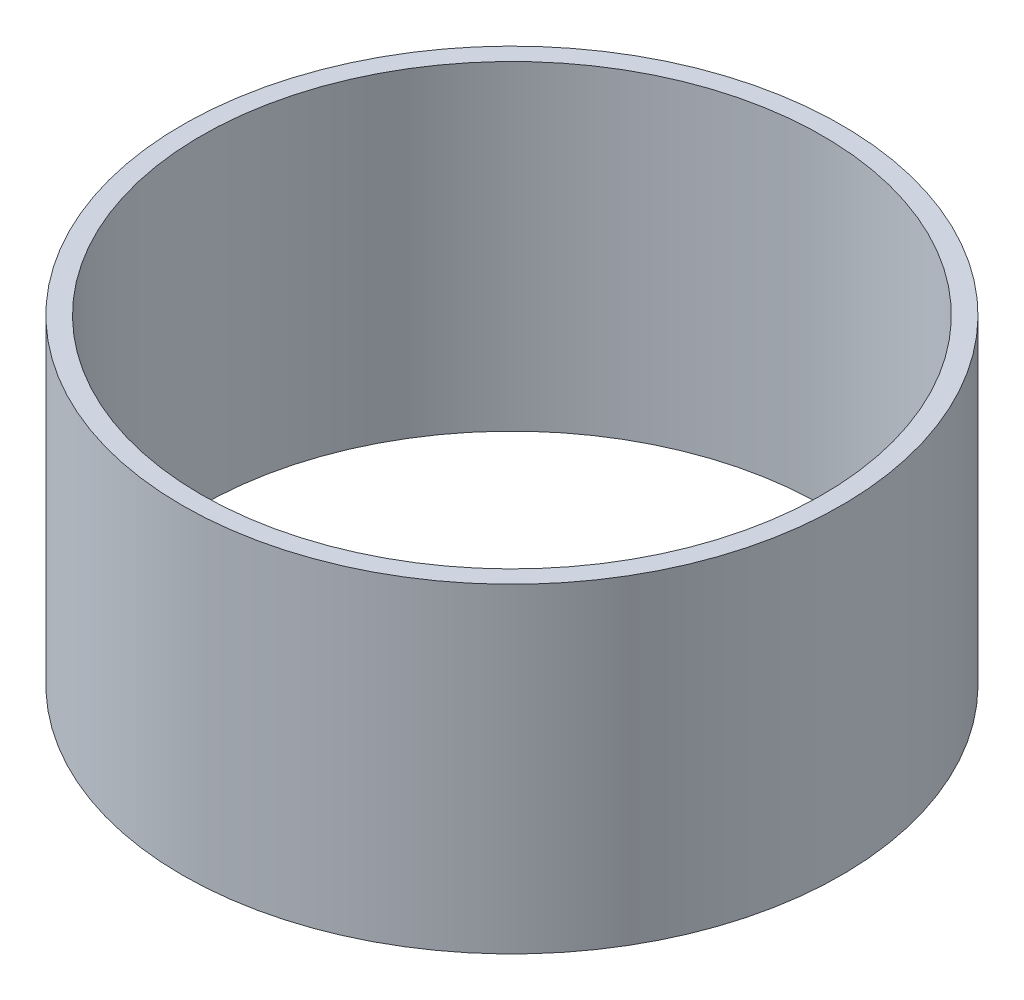
ISO-10303-21;
HEADER;
FILE_DESCRIPTION(('STEP AP214'),'2;1');
FILE_NAME('part.step','',(''),(''),'','','');
FILE_SCHEMA(('AUTOMOTIVE_DESIGN { 1 0 10303 214 1 1 1 1 }'));
ENDSEC;
DATA;
#1=APPLICATION_CONTEXT('core data for automotive mechanical design processes');
#2=APPLICATION_PROTOCOL_DEFINITION('international standard','automotive_design',2000,#1);
#3=PRODUCT_CONTEXT('',#1,'mechanical');
#4=PRODUCT('Part','Part','',(#3));
#5=PRODUCT_RELATED_PRODUCT_CATEGORY('part','',(#4));
#6=PRODUCT_DEFINITION_FORMATION('','',#4);
#7=PRODUCT_DEFINITION_CONTEXT('part definition',#1,'design');
#8=PRODUCT_DEFINITION('design','',#6,#7);
#9=PRODUCT_DEFINITION_SHAPE('','',#8);
#10=(LENGTH_UNIT() NAMED_UNIT(*) SI_UNIT(.MILLI.,.METRE.));
#11=(NAMED_UNIT(*) PLANE_ANGLE_UNIT() SI_UNIT($,.RADIAN.));
#12=(NAMED_UNIT(*) SI_UNIT($,.STERADIAN.) SOLID_ANGLE_UNIT());
#13=UNCERTAINTY_MEASURE_WITH_UNIT(LENGTH_MEASURE(1.E-05),#10,'distance_accuracy_value','');
#14=(GEOMETRIC_REPRESENTATION_CONTEXT(3) GLOBAL_UNCERTAINTY_ASSIGNED_CONTEXT((#13)) GLOBAL_UNIT_ASSIGNED_CONTEXT((#10,
#11,#12)) REPRESENTATION_CONTEXT('',''));
#15=CARTESIAN_POINT('',(0.,0.,0.));
#16=DIRECTION('',(0.,0.,1.));
#17=DIRECTION('',(1.,0.,0.));
#18=AXIS2_PLACEMENT_3D('',#15,#16,#17);
#19=CARTESIAN_POINT('',(0.,17.,0.));
#20=DIRECTION('',(0.,1.,0.));
#21=DIRECTION('',(0.,0.,1.));
#22=AXIS2_PLACEMENT_3D('',#19,#20,#21);
#23=PLANE('',#22);
#24=CARTESIAN_POINT('',(0.,17.,0.));
#25=DIRECTION('',(0.,1.,0.));
#26=DIRECTION('',(0.,0.,1.));
#27=AXIS2_PLACEMENT_3D('',#24,#25,#26);
#28=CIRCLE('',#27,17.5);
#29=CARTESIAN_POINT('',(0.,17.,17.5));
#30=VERTEX_POINT('',#29);
#31=EDGE_CURVE('E10',#30,#30,#28,.T.);
#32=ORIENTED_EDGE('',*,*,#31,.T.);
#33=EDGE_LOOP('',(#32));
#34=FACE_BOUND('',#33,.T.);
#35=CARTESIAN_POINT('',(0.,17.,0.));
#36=DIRECTION('',(0.,1.,0.));
#37=DIRECTION('',(0.,0.,1.));
#38=AXIS2_PLACEMENT_3D('',#35,#36,#37);
#39=CIRCLE('',#38,16.5);
#40=CARTESIAN_POINT('',(0.,17.,16.5));
#41=VERTEX_POINT('',#40);
#42=EDGE_CURVE('E55',#41,#41,#39,.T.);
#43=ORIENTED_EDGE('',*,*,#42,.F.);
#44=EDGE_LOOP('',(#43));
#45=FACE_BOUND('',#44,.T.);
#46=ADVANCED_FACE('F41',(#34,#45),#23,.T.);
#47=CARTESIAN_POINT('',(0.,0.,0.));
#48=DIRECTION('',(0.,1.,0.));
#49=DIRECTION('',(0.,0.,1.));
#50=AXIS2_PLACEMENT_3D('',#47,#48,#49);
#51=PLANE('',#50);
#52=CARTESIAN_POINT('',(0.,0.,0.));
#53=DIRECTION('',(0.,1.,0.));
#54=DIRECTION('',(0.,0.,1.));
#55=AXIS2_PLACEMENT_3D('',#52,#53,#54);
#56=CIRCLE('',#55,17.5);
#57=CARTESIAN_POINT('',(0.,0.,17.5));
#58=VERTEX_POINT('',#57);
#59=EDGE_CURVE('E44',#58,#58,#56,.T.);
#60=ORIENTED_EDGE('',*,*,#59,.F.);
#61=EDGE_LOOP('',(#60));
#62=FACE_BOUND('',#61,.T.);
#63=CARTESIAN_POINT('',(0.,0.,0.));
#64=DIRECTION('',(0.,1.,0.));
#65=DIRECTION('',(0.,0.,1.));
#66=AXIS2_PLACEMENT_3D('',#63,#64,#65);
#67=CIRCLE('',#66,16.5);
#68=CARTESIAN_POINT('',(0.,0.,16.5));
#69=VERTEX_POINT('',#68);
#70=EDGE_CURVE('E53',#69,#69,#67,.T.);
#71=ORIENTED_EDGE('',*,*,#70,.T.);
#72=EDGE_LOOP('',(#71));
#73=FACE_BOUND('',#72,.T.);
#74=ADVANCED_FACE('F63',(#62,#73),#51,.F.);
#75=CARTESIAN_POINT('',(0.,17.,0.));
#76=DIRECTION('',(0.,-1.,0.));
#77=DIRECTION('',(0.,0.,-1.));
#78=AXIS2_PLACEMENT_3D('',#75,#76,#77);
#79=CYLINDRICAL_SURFACE('',#78,17.5);
#80=ORIENTED_EDGE('',*,*,#31,.F.);
#81=EDGE_LOOP('',(#80));
#82=FACE_BOUND('',#81,.T.);
#83=ORIENTED_EDGE('',*,*,#59,.T.);
#84=EDGE_LOOP('',(#83));
#85=FACE_BOUND('',#84,.T.);
#86=ADVANCED_FACE('F43',(#82,#85),#79,.T.);
#87=CARTESIAN_POINT('',(0.,17.,0.));
#88=DIRECTION('',(0.,-1.,0.));
#89=DIRECTION('',(0.,0.,-1.));
#90=AXIS2_PLACEMENT_3D('',#87,#88,#89);
#91=CYLINDRICAL_SURFACE('',#90,16.5);
#92=ORIENTED_EDGE('',*,*,#42,.T.);
#93=EDGE_LOOP('',(#92));
#94=FACE_BOUND('',#93,.T.);
#95=ORIENTED_EDGE('',*,*,#70,.F.);
#96=EDGE_LOOP('',(#95));
#97=FACE_BOUND('',#96,.T.);
#98=ADVANCED_FACE('F58',(#94,#97),#91,.F.);
#99=CLOSED_SHELL('',(#46,#74,#86,#98));
#100=MANIFOLD_SOLID_BREP('B2',#99);
#101=ADVANCED_BREP_SHAPE_REPRESENTATION('',(#18,#100),#14);
#102=SHAPE_DEFINITION_REPRESENTATION(#9,#101);
ENDSEC;
END-ISO-10303-21;
